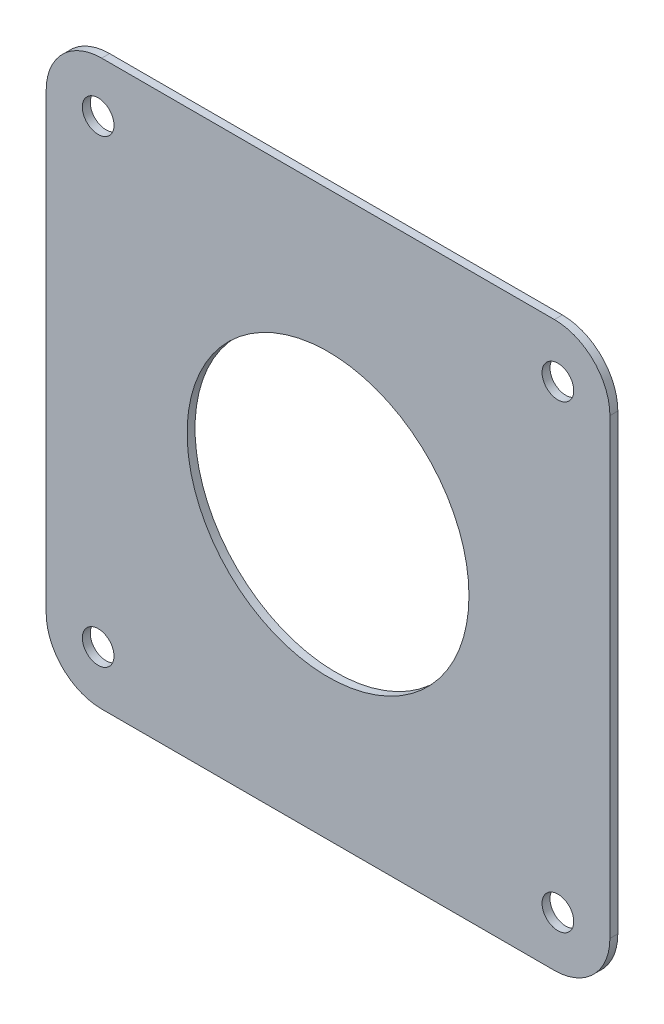
ISO-10303-21;
HEADER;
FILE_DESCRIPTION(('STEP AP214'),'2;1');
FILE_NAME('part.step','',(''),(''),'','','');
FILE_SCHEMA(('AUTOMOTIVE_DESIGN { 1 0 10303 214 1 1 1 1 }'));
ENDSEC;
DATA;
#1=APPLICATION_CONTEXT('core data for automotive mechanical design processes');
#2=APPLICATION_PROTOCOL_DEFINITION('international standard','automotive_design',2000,#1);
#3=PRODUCT_CONTEXT('',#1,'mechanical');
#4=PRODUCT('Part','Part','',(#3));
#5=PRODUCT_RELATED_PRODUCT_CATEGORY('part','',(#4));
#6=PRODUCT_DEFINITION_FORMATION('','',#4);
#7=PRODUCT_DEFINITION_CONTEXT('part definition',#1,'design');
#8=PRODUCT_DEFINITION('design','',#6,#7);
#9=PRODUCT_DEFINITION_SHAPE('','',#8);
#10=(LENGTH_UNIT() NAMED_UNIT(*) SI_UNIT(.MILLI.,.METRE.));
#11=(NAMED_UNIT(*) PLANE_ANGLE_UNIT() SI_UNIT($,.RADIAN.));
#12=(NAMED_UNIT(*) SI_UNIT($,.STERADIAN.) SOLID_ANGLE_UNIT());
#13=UNCERTAINTY_MEASURE_WITH_UNIT(LENGTH_MEASURE(1.E-05),#10,'distance_accuracy_value','');
#14=(GEOMETRIC_REPRESENTATION_CONTEXT(3) GLOBAL_UNCERTAINTY_ASSIGNED_CONTEXT((#13)) GLOBAL_UNIT_ASSIGNED_CONTEXT((#10,
#11,#12)) REPRESENTATION_CONTEXT('',''));
#15=CARTESIAN_POINT('',(0.,0.,0.));
#16=DIRECTION('',(0.,0.,1.));
#17=DIRECTION('',(1.,0.,0.));
#18=AXIS2_PLACEMENT_3D('',#15,#16,#17);
#19=CARTESIAN_POINT('',(28.56,-28.56,1.));
#20=DIRECTION('',(0.,0.,-1.));
#21=DIRECTION('',(-1.,0.,0.));
#22=AXIS2_PLACEMENT_3D('',#19,#20,#21);
#23=PLANE('',#22);
#24=CARTESIAN_POINT('',(28.56,-28.56,1.));
#25=DIRECTION('',(0.,0.,1.));
#26=DIRECTION('',(-1.,0.,0.));
#27=AXIS2_PLACEMENT_3D('',#24,#25,#26);
#28=CIRCLE('',#27,7.);
#29=CARTESIAN_POINT('',(28.56,-35.56,1.));
#30=VERTEX_POINT('',#29);
#31=CARTESIAN_POINT('',(35.56,-28.56,1.));
#32=VERTEX_POINT('',#31);
#33=EDGE_CURVE('E151',#30,#32,#28,.T.);
#34=ORIENTED_EDGE('',*,*,#33,.T.);
#35=DIRECTION('',(0.,1.,0.));
#36=VECTOR('',#35,1.);
#37=CARTESIAN_POINT('',(35.56,-28.56,1.));
#38=LINE('',#37,#36);
#39=CARTESIAN_POINT('',(35.56,28.56,1.));
#40=VERTEX_POINT('',#39);
#41=EDGE_CURVE('E99',#32,#40,#38,.T.);
#42=ORIENTED_EDGE('',*,*,#41,.T.);
#43=CARTESIAN_POINT('',(28.56,28.56,1.));
#44=DIRECTION('',(0.,0.,1.));
#45=DIRECTION('',(1.,0.,0.));
#46=AXIS2_PLACEMENT_3D('',#43,#44,#45);
#47=CIRCLE('',#46,7.);
#48=CARTESIAN_POINT('',(28.56,35.56,1.));
#49=VERTEX_POINT('',#48);
#50=EDGE_CURVE('E166',#40,#49,#47,.T.);
#51=ORIENTED_EDGE('',*,*,#50,.T.);
#52=DIRECTION('',(-1.,0.,0.));
#53=VECTOR('',#52,1.);
#54=CARTESIAN_POINT('',(28.56,35.56,1.));
#55=LINE('',#54,#53);
#56=CARTESIAN_POINT('',(-28.56,35.56,1.));
#57=VERTEX_POINT('',#56);
#58=EDGE_CURVE('E179',#49,#57,#55,.T.);
#59=ORIENTED_EDGE('',*,*,#58,.T.);
#60=CARTESIAN_POINT('',(-28.56,28.56,1.));
#61=DIRECTION('',(0.,0.,1.));
#62=DIRECTION('',(-1.,0.,0.));
#63=AXIS2_PLACEMENT_3D('',#60,#61,#62);
#64=CIRCLE('',#63,7.);
#65=CARTESIAN_POINT('',(-35.56,28.56,1.));
#66=VERTEX_POINT('',#65);
#67=EDGE_CURVE('E118',#57,#66,#64,.T.);
#68=ORIENTED_EDGE('',*,*,#67,.T.);
#69=DIRECTION('',(0.,-1.,0.));
#70=VECTOR('',#69,1.);
#71=CARTESIAN_POINT('',(-35.56,-28.56,1.));
#72=LINE('',#71,#70);
#73=CARTESIAN_POINT('',(-35.56,-28.56,1.));
#74=VERTEX_POINT('',#73);
#75=EDGE_CURVE('E112',#66,#74,#72,.T.);
#76=ORIENTED_EDGE('',*,*,#75,.T.);
#77=CARTESIAN_POINT('',(-28.56,-28.56,1.));
#78=DIRECTION('',(0.,0.,1.));
#79=DIRECTION('',(-1.,0.,0.));
#80=AXIS2_PLACEMENT_3D('',#77,#78,#79);
#81=CIRCLE('',#80,7.);
#82=CARTESIAN_POINT('',(-28.56,-35.56,1.));
#83=VERTEX_POINT('',#82);
#84=EDGE_CURVE('E116',#74,#83,#81,.T.);
#85=ORIENTED_EDGE('',*,*,#84,.T.);
#86=DIRECTION('',(1.,0.,0.));
#87=VECTOR('',#86,1.);
#88=CARTESIAN_POINT('',(28.56,-35.56,1.));
#89=LINE('',#88,#87);
#90=EDGE_CURVE('E56',#83,#30,#89,.T.);
#91=ORIENTED_EDGE('',*,*,#90,.T.);
#92=EDGE_LOOP('',(#34,#42,#51,#59,#68,#76,#85,#91));
#93=FACE_BOUND('',#92,.T.);
#94=CARTESIAN_POINT('',(0.,0.,1.));
#95=DIRECTION('',(0.,0.,1.));
#96=DIRECTION('',(1.,0.,0.));
#97=AXIS2_PLACEMENT_3D('',#94,#95,#96);
#98=CIRCLE('',#97,17.78);
#99=CARTESIAN_POINT('',(17.78,0.,1.));
#100=VERTEX_POINT('',#99);
#101=EDGE_CURVE('E140',#100,#100,#98,.T.);
#102=ORIENTED_EDGE('',*,*,#101,.F.);
#103=EDGE_LOOP('',(#102));
#104=FACE_BOUND('',#103,.T.);
#105=CARTESIAN_POINT('',(-29.,-29.,1.));
#106=DIRECTION('',(0.,0.,1.));
#107=DIRECTION('',(1.,0.,0.));
#108=AXIS2_PLACEMENT_3D('',#105,#106,#107);
#109=CIRCLE('',#108,2.00000000000001);
#110=CARTESIAN_POINT('',(-27.,-29.,1.));
#111=VERTEX_POINT('',#110);
#112=EDGE_CURVE('E188',#111,#111,#109,.T.);
#113=ORIENTED_EDGE('',*,*,#112,.F.);
#114=EDGE_LOOP('',(#113));
#115=FACE_BOUND('',#114,.T.);
#116=CARTESIAN_POINT('',(29.,29.,1.));
#117=DIRECTION('',(0.,0.,1.));
#118=DIRECTION('',(-1.,0.,0.));
#119=AXIS2_PLACEMENT_3D('',#116,#117,#118);
#120=CIRCLE('',#119,2.00000000000001);
#121=CARTESIAN_POINT('',(27.,29.,1.));
#122=VERTEX_POINT('',#121);
#123=EDGE_CURVE('E194',#122,#122,#120,.T.);
#124=ORIENTED_EDGE('',*,*,#123,.F.);
#125=EDGE_LOOP('',(#124));
#126=FACE_BOUND('',#125,.T.);
#127=CARTESIAN_POINT('',(-29.,29.,1.));
#128=DIRECTION('',(0.,0.,1.));
#129=DIRECTION('',(1.,0.,0.));
#130=AXIS2_PLACEMENT_3D('',#127,#128,#129);
#131=CIRCLE('',#130,2.);
#132=CARTESIAN_POINT('',(-27.,29.,1.));
#133=VERTEX_POINT('',#132);
#134=EDGE_CURVE('E200',#133,#133,#131,.T.);
#135=ORIENTED_EDGE('',*,*,#134,.F.);
#136=EDGE_LOOP('',(#135));
#137=FACE_BOUND('',#136,.T.);
#138=CARTESIAN_POINT('',(29.,-29.,1.));
#139=DIRECTION('',(0.,0.,1.));
#140=DIRECTION('',(-1.,0.,0.));
#141=AXIS2_PLACEMENT_3D('',#138,#139,#140);
#142=CIRCLE('',#141,2.00000000000001);
#143=CARTESIAN_POINT('',(27.,-29.,1.));
#144=VERTEX_POINT('',#143);
#145=EDGE_CURVE('E206',#144,#144,#142,.T.);
#146=ORIENTED_EDGE('',*,*,#145,.F.);
#147=EDGE_LOOP('',(#146));
#148=FACE_BOUND('',#147,.T.);
#149=ADVANCED_FACE('F39',(#93,#104,#115,#126,#137,#148),#23,.F.);
#150=CARTESIAN_POINT('',(28.56,-28.56,0.));
#151=DIRECTION('',(0.,0.,-1.));
#152=DIRECTION('',(-1.,0.,0.));
#153=AXIS2_PLACEMENT_3D('',#150,#151,#152);
#154=PLANE('',#153);
#155=CARTESIAN_POINT('',(-29.,29.,0.));
#156=DIRECTION('',(0.,0.,1.));
#157=DIRECTION('',(1.,0.,0.));
#158=AXIS2_PLACEMENT_3D('',#155,#156,#157);
#159=CIRCLE('',#158,2.);
#160=CARTESIAN_POINT('',(-27.,29.,0.));
#161=VERTEX_POINT('',#160);
#162=EDGE_CURVE('E203',#161,#161,#159,.T.);
#163=ORIENTED_EDGE('',*,*,#162,.T.);
#164=EDGE_LOOP('',(#163));
#165=FACE_BOUND('',#164,.T.);
#166=CARTESIAN_POINT('',(-29.,-29.,0.));
#167=DIRECTION('',(0.,0.,1.));
#168=DIRECTION('',(1.,0.,0.));
#169=AXIS2_PLACEMENT_3D('',#166,#167,#168);
#170=CIRCLE('',#169,2.00000000000001);
#171=CARTESIAN_POINT('',(-27.,-29.,0.));
#172=VERTEX_POINT('',#171);
#173=EDGE_CURVE('E191',#172,#172,#170,.T.);
#174=ORIENTED_EDGE('',*,*,#173,.T.);
#175=EDGE_LOOP('',(#174));
#176=FACE_BOUND('',#175,.T.);
#177=CARTESIAN_POINT('',(28.56,-28.56,0.));
#178=DIRECTION('',(0.,0.,1.));
#179=DIRECTION('',(-1.,0.,0.));
#180=AXIS2_PLACEMENT_3D('',#177,#178,#179);
#181=CIRCLE('',#180,7.);
#182=CARTESIAN_POINT('',(28.56,-35.56,0.));
#183=VERTEX_POINT('',#182);
#184=CARTESIAN_POINT('',(35.56,-28.56,0.));
#185=VERTEX_POINT('',#184);
#186=EDGE_CURVE('E136',#183,#185,#181,.T.);
#187=ORIENTED_EDGE('',*,*,#186,.F.);
#188=DIRECTION('',(1.,0.,0.));
#189=VECTOR('',#188,1.);
#190=CARTESIAN_POINT('',(28.56,-35.56,0.));
#191=LINE('',#190,#189);
#192=CARTESIAN_POINT('',(-28.56,-35.56,0.));
#193=VERTEX_POINT('',#192);
#194=EDGE_CURVE('E91',#193,#183,#191,.T.);
#195=ORIENTED_EDGE('',*,*,#194,.F.);
#196=CARTESIAN_POINT('',(-28.56,-28.56,0.));
#197=DIRECTION('',(0.,0.,1.));
#198=DIRECTION('',(-1.,0.,0.));
#199=AXIS2_PLACEMENT_3D('',#196,#197,#198);
#200=CIRCLE('',#199,7.);
#201=CARTESIAN_POINT('',(-35.56,-28.56,0.));
#202=VERTEX_POINT('',#201);
#203=EDGE_CURVE('E85',#202,#193,#200,.T.);
#204=ORIENTED_EDGE('',*,*,#203,.F.);
#205=DIRECTION('',(0.,-1.,0.));
#206=VECTOR('',#205,1.);
#207=CARTESIAN_POINT('',(-35.56,-28.56,0.));
#208=LINE('',#207,#206);
#209=CARTESIAN_POINT('',(-35.56,28.56,0.));
#210=VERTEX_POINT('',#209);
#211=EDGE_CURVE('E126',#210,#202,#208,.T.);
#212=ORIENTED_EDGE('',*,*,#211,.F.);
#213=CARTESIAN_POINT('',(-28.56,28.56,0.));
#214=DIRECTION('',(0.,0.,1.));
#215=DIRECTION('',(-1.,0.,0.));
#216=AXIS2_PLACEMENT_3D('',#213,#214,#215);
#217=CIRCLE('',#216,7.);
#218=CARTESIAN_POINT('',(-28.56,35.56,0.));
#219=VERTEX_POINT('',#218);
#220=EDGE_CURVE('E146',#219,#210,#217,.T.);
#221=ORIENTED_EDGE('',*,*,#220,.F.);
#222=DIRECTION('',(-1.,0.,0.));
#223=VECTOR('',#222,1.);
#224=CARTESIAN_POINT('',(28.56,35.56,0.));
#225=LINE('',#224,#223);
#226=CARTESIAN_POINT('',(28.56,35.56,0.));
#227=VERTEX_POINT('',#226);
#228=EDGE_CURVE('E144',#227,#219,#225,.T.);
#229=ORIENTED_EDGE('',*,*,#228,.F.);
#230=CARTESIAN_POINT('',(28.56,28.56,0.));
#231=DIRECTION('',(0.,0.,1.));
#232=DIRECTION('',(1.,0.,0.));
#233=AXIS2_PLACEMENT_3D('',#230,#231,#232);
#234=CIRCLE('',#233,7.);
#235=CARTESIAN_POINT('',(35.56,28.56,0.));
#236=VERTEX_POINT('',#235);
#237=EDGE_CURVE('E142',#236,#227,#234,.T.);
#238=ORIENTED_EDGE('',*,*,#237,.F.);
#239=DIRECTION('',(0.,1.,0.));
#240=VECTOR('',#239,1.);
#241=CARTESIAN_POINT('',(35.56,-28.56,0.));
#242=LINE('',#241,#240);
#243=EDGE_CURVE('E139',#185,#236,#242,.T.);
#244=ORIENTED_EDGE('',*,*,#243,.F.);
#245=EDGE_LOOP('',(#187,#195,#204,#212,#221,#229,#238,#244));
#246=FACE_BOUND('',#245,.T.);
#247=CARTESIAN_POINT('',(0.,0.,0.));
#248=DIRECTION('',(0.,0.,1.));
#249=DIRECTION('',(1.,0.,0.));
#250=AXIS2_PLACEMENT_3D('',#247,#248,#249);
#251=CIRCLE('',#250,17.78);
#252=CARTESIAN_POINT('',(17.78,0.,0.));
#253=VERTEX_POINT('',#252);
#254=EDGE_CURVE('E185',#253,#253,#251,.T.);
#255=ORIENTED_EDGE('',*,*,#254,.T.);
#256=EDGE_LOOP('',(#255));
#257=FACE_BOUND('',#256,.T.);
#258=CARTESIAN_POINT('',(29.,29.,0.));
#259=DIRECTION('',(0.,0.,1.));
#260=DIRECTION('',(-1.,0.,0.));
#261=AXIS2_PLACEMENT_3D('',#258,#259,#260);
#262=CIRCLE('',#261,2.00000000000001);
#263=CARTESIAN_POINT('',(27.,29.,0.));
#264=VERTEX_POINT('',#263);
#265=EDGE_CURVE('E197',#264,#264,#262,.T.);
#266=ORIENTED_EDGE('',*,*,#265,.T.);
#267=EDGE_LOOP('',(#266));
#268=FACE_BOUND('',#267,.T.);
#269=CARTESIAN_POINT('',(29.,-29.,0.));
#270=DIRECTION('',(0.,0.,1.));
#271=DIRECTION('',(-1.,0.,0.));
#272=AXIS2_PLACEMENT_3D('',#269,#270,#271);
#273=CIRCLE('',#272,2.00000000000001);
#274=CARTESIAN_POINT('',(27.,-29.,0.));
#275=VERTEX_POINT('',#274);
#276=EDGE_CURVE('E209',#275,#275,#273,.T.);
#277=ORIENTED_EDGE('',*,*,#276,.T.);
#278=EDGE_LOOP('',(#277));
#279=FACE_BOUND('',#278,.T.);
#280=ADVANCED_FACE('F170',(#165,#176,#246,#257,#268,#279),#154,.T.);
#281=CARTESIAN_POINT('',(28.56,-28.56,1.));
#282=DIRECTION('',(0.,0.,-1.));
#283=DIRECTION('',(-1.,0.,0.));
#284=AXIS2_PLACEMENT_3D('',#281,#282,#283);
#285=CYLINDRICAL_SURFACE('',#284,7.);
#286=ORIENTED_EDGE('',*,*,#186,.T.);
#287=DIRECTION('',(0.,0.,-1.));
#288=VECTOR('',#287,1.);
#289=CARTESIAN_POINT('',(35.56,-28.56,1.));
#290=LINE('',#289,#288);
#291=EDGE_CURVE('E11',#32,#185,#290,.T.);
#292=ORIENTED_EDGE('',*,*,#291,.F.);
#293=ORIENTED_EDGE('',*,*,#33,.F.);
#294=DIRECTION('',(0.,0.,-1.));
#295=VECTOR('',#294,1.);
#296=CARTESIAN_POINT('',(28.56,-35.56,1.));
#297=LINE('',#296,#295);
#298=EDGE_CURVE('E132',#30,#183,#297,.T.);
#299=ORIENTED_EDGE('',*,*,#298,.T.);
#300=EDGE_LOOP('',(#286,#292,#293,#299));
#301=FACE_BOUND('',#300,.T.);
#302=ADVANCED_FACE('F41',(#301),#285,.T.);
#303=CARTESIAN_POINT('',(35.56,-28.56,1.));
#304=DIRECTION('',(-1.,0.,0.));
#305=DIRECTION('',(0.,-1.,0.));
#306=AXIS2_PLACEMENT_3D('',#303,#304,#305);
#307=PLANE('',#306);
#308=ORIENTED_EDGE('',*,*,#243,.T.);
#309=DIRECTION('',(0.,0.,-1.));
#310=VECTOR('',#309,1.);
#311=CARTESIAN_POINT('',(35.56,28.56,1.));
#312=LINE('',#311,#310);
#313=EDGE_CURVE('E48',#40,#236,#312,.T.);
#314=ORIENTED_EDGE('',*,*,#313,.F.);
#315=ORIENTED_EDGE('',*,*,#41,.F.);
#316=ORIENTED_EDGE('',*,*,#291,.T.);
#317=EDGE_LOOP('',(#308,#314,#315,#316));
#318=FACE_BOUND('',#317,.T.);
#319=ADVANCED_FACE('F241',(#318),#307,.F.);
#320=CARTESIAN_POINT('',(28.56,28.56,1.));
#321=DIRECTION('',(0.,0.,-1.));
#322=DIRECTION('',(-1.,0.,0.));
#323=AXIS2_PLACEMENT_3D('',#320,#321,#322);
#324=CYLINDRICAL_SURFACE('',#323,7.);
#325=ORIENTED_EDGE('',*,*,#237,.T.);
#326=DIRECTION('',(0.,0.,-1.));
#327=VECTOR('',#326,1.);
#328=CARTESIAN_POINT('',(28.56,35.56,1.));
#329=LINE('',#328,#327);
#330=EDGE_CURVE('E158',#49,#227,#329,.T.);
#331=ORIENTED_EDGE('',*,*,#330,.F.);
#332=ORIENTED_EDGE('',*,*,#50,.F.);
#333=ORIENTED_EDGE('',*,*,#313,.T.);
#334=EDGE_LOOP('',(#325,#331,#332,#333));
#335=FACE_BOUND('',#334,.T.);
#336=ADVANCED_FACE('F164',(#335),#324,.T.);
#337=CARTESIAN_POINT('',(28.56,35.56,1.));
#338=DIRECTION('',(0.,-1.,0.));
#339=DIRECTION('',(0.,0.,-1.));
#340=AXIS2_PLACEMENT_3D('',#337,#338,#339);
#341=PLANE('',#340);
#342=ORIENTED_EDGE('',*,*,#228,.T.);
#343=DIRECTION('',(0.,0.,-1.));
#344=VECTOR('',#343,1.);
#345=CARTESIAN_POINT('',(-28.56,35.56,1.));
#346=LINE('',#345,#344);
#347=EDGE_CURVE('E155',#57,#219,#346,.T.);
#348=ORIENTED_EDGE('',*,*,#347,.F.);
#349=ORIENTED_EDGE('',*,*,#58,.F.);
#350=ORIENTED_EDGE('',*,*,#330,.T.);
#351=EDGE_LOOP('',(#342,#348,#349,#350));
#352=FACE_BOUND('',#351,.T.);
#353=ADVANCED_FACE('F175',(#352),#341,.F.);
#354=CARTESIAN_POINT('',(-28.56,28.56,1.));
#355=DIRECTION('',(0.,0.,-1.));
#356=DIRECTION('',(-1.,0.,0.));
#357=AXIS2_PLACEMENT_3D('',#354,#355,#356);
#358=CYLINDRICAL_SURFACE('',#357,7.);
#359=ORIENTED_EDGE('',*,*,#220,.T.);
#360=DIRECTION('',(0.,0.,-1.));
#361=VECTOR('',#360,1.);
#362=CARTESIAN_POINT('',(-35.56,28.56,1.));
#363=LINE('',#362,#361);
#364=EDGE_CURVE('E127',#66,#210,#363,.T.);
#365=ORIENTED_EDGE('',*,*,#364,.F.);
#366=ORIENTED_EDGE('',*,*,#67,.F.);
#367=ORIENTED_EDGE('',*,*,#347,.T.);
#368=EDGE_LOOP('',(#359,#365,#366,#367));
#369=FACE_BOUND('',#368,.T.);
#370=ADVANCED_FACE('F178',(#369),#358,.T.);
#371=CARTESIAN_POINT('',(-35.56,-28.56,1.));
#372=DIRECTION('',(1.,0.,0.));
#373=DIRECTION('',(0.,0.,-1.));
#374=AXIS2_PLACEMENT_3D('',#371,#372,#373);
#375=PLANE('',#374);
#376=ORIENTED_EDGE('',*,*,#211,.T.);
#377=DIRECTION('',(0.,0.,-1.));
#378=VECTOR('',#377,1.);
#379=CARTESIAN_POINT('',(-35.56,-28.56,1.));
#380=LINE('',#379,#378);
#381=EDGE_CURVE('E123',#74,#202,#380,.T.);
#382=ORIENTED_EDGE('',*,*,#381,.F.);
#383=ORIENTED_EDGE('',*,*,#75,.F.);
#384=ORIENTED_EDGE('',*,*,#364,.T.);
#385=EDGE_LOOP('',(#376,#382,#383,#384));
#386=FACE_BOUND('',#385,.T.);
#387=ADVANCED_FACE('F124',(#386),#375,.F.);
#388=CARTESIAN_POINT('',(-28.56,-28.56,1.));
#389=DIRECTION('',(0.,0.,-1.));
#390=DIRECTION('',(-1.,0.,0.));
#391=AXIS2_PLACEMENT_3D('',#388,#389,#390);
#392=CYLINDRICAL_SURFACE('',#391,7.);
#393=ORIENTED_EDGE('',*,*,#203,.T.);
#394=DIRECTION('',(0.,0.,-1.));
#395=VECTOR('',#394,1.);
#396=CARTESIAN_POINT('',(-28.56,-35.56,1.));
#397=LINE('',#396,#395);
#398=EDGE_CURVE('E128',#83,#193,#397,.T.);
#399=ORIENTED_EDGE('',*,*,#398,.F.);
#400=ORIENTED_EDGE('',*,*,#84,.F.);
#401=ORIENTED_EDGE('',*,*,#381,.T.);
#402=EDGE_LOOP('',(#393,#399,#400,#401));
#403=FACE_BOUND('',#402,.T.);
#404=ADVANCED_FACE('F130',(#403),#392,.T.);
#405=CARTESIAN_POINT('',(28.56,-35.56,1.));
#406=DIRECTION('',(0.,1.,0.));
#407=DIRECTION('',(-1.,0.,0.));
#408=AXIS2_PLACEMENT_3D('',#405,#406,#407);
#409=PLANE('',#408);
#410=ORIENTED_EDGE('',*,*,#194,.T.);
#411=ORIENTED_EDGE('',*,*,#298,.F.);
#412=ORIENTED_EDGE('',*,*,#90,.F.);
#413=ORIENTED_EDGE('',*,*,#398,.T.);
#414=EDGE_LOOP('',(#410,#411,#412,#413));
#415=FACE_BOUND('',#414,.T.);
#416=ADVANCED_FACE('F229',(#415),#409,.F.);
#417=CARTESIAN_POINT('',(0.,0.,1.));
#418=DIRECTION('',(0.,0.,-1.));
#419=DIRECTION('',(-1.,0.,0.));
#420=AXIS2_PLACEMENT_3D('',#417,#418,#419);
#421=CYLINDRICAL_SURFACE('',#420,17.78);
#422=ORIENTED_EDGE('',*,*,#101,.T.);
#423=EDGE_LOOP('',(#422));
#424=FACE_BOUND('',#423,.T.);
#425=ORIENTED_EDGE('',*,*,#254,.F.);
#426=EDGE_LOOP('',(#425));
#427=FACE_BOUND('',#426,.T.);
#428=ADVANCED_FACE('F226',(#424,#427),#421,.F.);
#429=CARTESIAN_POINT('',(-29.,-29.,1.));
#430=DIRECTION('',(0.,0.,-1.));
#431=DIRECTION('',(-1.,0.,0.));
#432=AXIS2_PLACEMENT_3D('',#429,#430,#431);
#433=CYLINDRICAL_SURFACE('',#432,2.00000000000001);
#434=ORIENTED_EDGE('',*,*,#112,.T.);
#435=EDGE_LOOP('',(#434));
#436=FACE_BOUND('',#435,.T.);
#437=ORIENTED_EDGE('',*,*,#173,.F.);
#438=EDGE_LOOP('',(#437));
#439=FACE_BOUND('',#438,.T.);
#440=ADVANCED_FACE('F304',(#436,#439),#433,.F.);
#441=CARTESIAN_POINT('',(29.,29.,1.));
#442=DIRECTION('',(0.,0.,-1.));
#443=DIRECTION('',(-1.,0.,0.));
#444=AXIS2_PLACEMENT_3D('',#441,#442,#443);
#445=CYLINDRICAL_SURFACE('',#444,2.00000000000001);
#446=ORIENTED_EDGE('',*,*,#123,.T.);
#447=EDGE_LOOP('',(#446));
#448=FACE_BOUND('',#447,.T.);
#449=ORIENTED_EDGE('',*,*,#265,.F.);
#450=EDGE_LOOP('',(#449));
#451=FACE_BOUND('',#450,.T.);
#452=ADVANCED_FACE('F312',(#448,#451),#445,.F.);
#453=CARTESIAN_POINT('',(-29.,29.,1.));
#454=DIRECTION('',(0.,0.,-1.));
#455=DIRECTION('',(-1.,0.,0.));
#456=AXIS2_PLACEMENT_3D('',#453,#454,#455);
#457=CYLINDRICAL_SURFACE('',#456,2.);
#458=ORIENTED_EDGE('',*,*,#134,.T.);
#459=EDGE_LOOP('',(#458));
#460=FACE_BOUND('',#459,.T.);
#461=ORIENTED_EDGE('',*,*,#162,.F.);
#462=EDGE_LOOP('',(#461));
#463=FACE_BOUND('',#462,.T.);
#464=ADVANCED_FACE('F320',(#460,#463),#457,.F.);
#465=CARTESIAN_POINT('',(29.,-29.,1.));
#466=DIRECTION('',(0.,0.,-1.));
#467=DIRECTION('',(-1.,0.,0.));
#468=AXIS2_PLACEMENT_3D('',#465,#466,#467);
#469=CYLINDRICAL_SURFACE('',#468,2.00000000000001);
#470=ORIENTED_EDGE('',*,*,#145,.T.);
#471=EDGE_LOOP('',(#470));
#472=FACE_BOUND('',#471,.T.);
#473=ORIENTED_EDGE('',*,*,#276,.F.);
#474=EDGE_LOOP('',(#473));
#475=FACE_BOUND('',#474,.T.);
#476=ADVANCED_FACE('F215',(#472,#475),#469,.F.);
#477=CLOSED_SHELL('',(#149,#280,#302,#319,#336,#353,#370,#387,#404,#416,#428,#440,#452,#464,#476));
#478=MANIFOLD_SOLID_BREP('B2',#477);
#479=ADVANCED_BREP_SHAPE_REPRESENTATION('',(#18,#478),#14);
#480=SHAPE_DEFINITION_REPRESENTATION(#9,#479);
ENDSEC;
END-ISO-10303-21;
